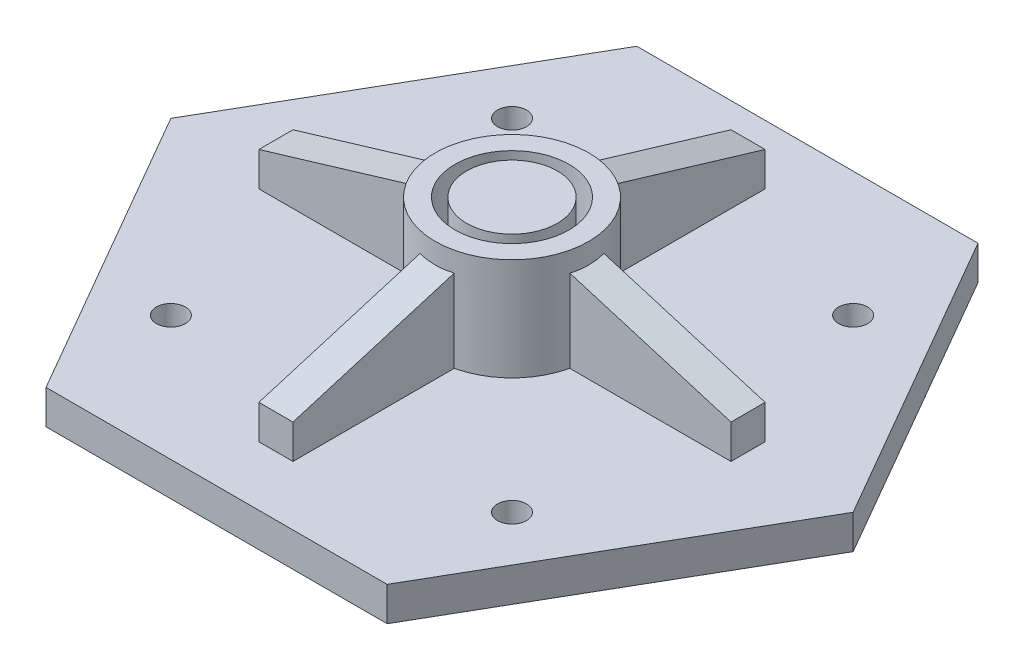
ISO-10303-21;
HEADER;
FILE_DESCRIPTION(('STEP AP214'),'2;1');
FILE_NAME('part.step','',(''),(''),'','','');
FILE_SCHEMA(('AUTOMOTIVE_DESIGN { 1 0 10303 214 1 1 1 1 }'));
ENDSEC;
DATA;
#1=APPLICATION_CONTEXT('core data for automotive mechanical design processes');
#2=APPLICATION_PROTOCOL_DEFINITION('international standard','automotive_design',2000,#1);
#3=PRODUCT_CONTEXT('',#1,'mechanical');
#4=PRODUCT('Part','Part','',(#3));
#5=PRODUCT_RELATED_PRODUCT_CATEGORY('part','',(#4));
#6=PRODUCT_DEFINITION_FORMATION('','',#4);
#7=PRODUCT_DEFINITION_CONTEXT('part definition',#1,'design');
#8=PRODUCT_DEFINITION('design','',#6,#7);
#9=PRODUCT_DEFINITION_SHAPE('','',#8);
#10=(LENGTH_UNIT() NAMED_UNIT(*) SI_UNIT(.MILLI.,.METRE.));
#11=(NAMED_UNIT(*) PLANE_ANGLE_UNIT() SI_UNIT($,.RADIAN.));
#12=(NAMED_UNIT(*) SI_UNIT($,.STERADIAN.) SOLID_ANGLE_UNIT());
#13=UNCERTAINTY_MEASURE_WITH_UNIT(LENGTH_MEASURE(1.E-05),#10,'distance_accuracy_value','');
#14=(GEOMETRIC_REPRESENTATION_CONTEXT(3) GLOBAL_UNCERTAINTY_ASSIGNED_CONTEXT((#13)) GLOBAL_UNIT_ASSIGNED_CONTEXT((#10,
#11,#12)) REPRESENTATION_CONTEXT('',''));
#15=CARTESIAN_POINT('',(0.,0.,0.));
#16=DIRECTION('',(0.,0.,1.));
#17=DIRECTION('',(1.,0.,0.));
#18=AXIS2_PLACEMENT_3D('',#15,#16,#17);
#19=CARTESIAN_POINT('',(0.,40.,0.));
#20=DIRECTION('',(0.,-1.,0.));
#21=DIRECTION('',(0.,0.,-1.));
#22=AXIS2_PLACEMENT_3D('',#19,#20,#21);
#23=CYLINDRICAL_SURFACE('',#22,22.5);
#24=CARTESIAN_POINT('',(0.,40.,0.));
#25=DIRECTION('',(0.,1.,0.));
#26=DIRECTION('',(0.,0.,1.));
#27=AXIS2_PLACEMENT_3D('',#24,#25,#26);
#28=CIRCLE('',#27,22.5);
#29=CARTESIAN_POINT('',(0.,40.,22.5));
#30=VERTEX_POINT('',#29);
#31=EDGE_CURVE('E348',#30,#30,#28,.T.);
#32=ORIENTED_EDGE('',*,*,#31,.F.);
#33=EDGE_LOOP('',(#32));
#34=FACE_BOUND('',#33,.T.);
#35=CARTESIAN_POINT('',(0.,40.76,0.));
#36=DIRECTION('',(0.287347885566345,-0.957826285221151,0.));
#37=DIRECTION('',(-0.957826285221151,-0.287347885566345,0.));
#38=AXIS2_PLACEMENT_3D('',#35,#36,#37);
#39=ELLIPSE('',#38,23.4906896450487,22.5);
#40=CARTESIAN_POINT('',(-21.9374109684803,34.1787767094559,4.99999999999992));
#41=VERTEX_POINT('',#40);
#42=CARTESIAN_POINT('',(-21.9374109684803,34.1787767094559,-5.00000000000008));
#43=VERTEX_POINT('',#42);
#44=EDGE_CURVE('E11',#41,#43,#39,.T.);
#45=ORIENTED_EDGE('',*,*,#44,.F.);
#46=DIRECTION('',(0.,-1.,0.));
#47=VECTOR('',#46,1.);
#48=CARTESIAN_POINT('',(-21.9374109684803,40.,4.99999999999992));
#49=LINE('',#48,#47);
#50=CARTESIAN_POINT('',(-21.9374109684803,10.,4.99999999999992));
#51=VERTEX_POINT('',#50);
#52=EDGE_CURVE('E190',#41,#51,#49,.T.);
#53=ORIENTED_EDGE('',*,*,#52,.T.);
#54=CARTESIAN_POINT('',(0.,10.,0.));
#55=DIRECTION('',(0.,-1.,0.));
#56=DIRECTION('',(0.,0.,-1.));
#57=AXIS2_PLACEMENT_3D('',#54,#55,#56);
#58=CIRCLE('',#57,22.5);
#59=CARTESIAN_POINT('',(-5.,10.,21.9374109684803));
#60=VERTEX_POINT('',#59);
#61=EDGE_CURVE('E354',#60,#51,#58,.T.);
#62=ORIENTED_EDGE('',*,*,#61,.F.);
#63=DIRECTION('',(0.,-1.,0.));
#64=VECTOR('',#63,1.);
#65=CARTESIAN_POINT('',(-5.,40.,21.9374109684803));
#66=LINE('',#65,#64);
#67=CARTESIAN_POINT('',(-5.,34.1787767094559,21.9374109684803));
#68=VERTEX_POINT('',#67);
#69=EDGE_CURVE('E284',#68,#60,#66,.T.);
#70=ORIENTED_EDGE('',*,*,#69,.F.);
#71=CARTESIAN_POINT('',(0.,40.76,0.));
#72=DIRECTION('',(0.,-0.957826285221151,-0.287347885566345));
#73=DIRECTION('',(0.,-0.287347885566345,0.957826285221151));
#74=AXIS2_PLACEMENT_3D('',#71,#72,#73);
#75=ELLIPSE('',#74,23.4906896450487,22.5);
#76=CARTESIAN_POINT('',(5.,34.1787767094559,21.9374109684803));
#77=VERTEX_POINT('',#76);
#78=EDGE_CURVE('E357',#77,#68,#75,.T.);
#79=ORIENTED_EDGE('',*,*,#78,.F.);
#80=DIRECTION('',(0.,-1.,0.));
#81=VECTOR('',#80,1.);
#82=CARTESIAN_POINT('',(5.,40.,21.9374109684803));
#83=LINE('',#82,#81);
#84=CARTESIAN_POINT('',(5.,10.,21.9374109684803));
#85=VERTEX_POINT('',#84);
#86=EDGE_CURVE('E287',#77,#85,#83,.T.);
#87=ORIENTED_EDGE('',*,*,#86,.T.);
#88=CARTESIAN_POINT('',(21.9374109684803,10.,5.00000000000023));
#89=VERTEX_POINT('',#88);
#90=EDGE_CURVE('E353',#89,#85,#58,.T.);
#91=ORIENTED_EDGE('',*,*,#90,.F.);
#92=DIRECTION('',(0.,-1.,0.));
#93=VECTOR('',#92,1.);
#94=CARTESIAN_POINT('',(21.9374109684803,40.,5.00000000000023));
#95=LINE('',#94,#93);
#96=CARTESIAN_POINT('',(21.9374109684803,34.1787767094559,5.00000000000023));
#97=VERTEX_POINT('',#96);
#98=EDGE_CURVE('E207',#97,#89,#95,.T.);
#99=ORIENTED_EDGE('',*,*,#98,.F.);
#100=CARTESIAN_POINT('',(0.,40.76,0.));
#101=DIRECTION('',(-0.287347885566345,-0.957826285221151,0.));
#102=DIRECTION('',(0.957826285221151,-0.287347885566345,0.));
#103=AXIS2_PLACEMENT_3D('',#100,#101,#102);
#104=ELLIPSE('',#103,23.4906896450487,22.5);
#105=CARTESIAN_POINT('',(21.9374109684804,34.1787767094559,-4.99999999999977));
#106=VERTEX_POINT('',#105);
#107=EDGE_CURVE('E361',#106,#97,#104,.T.);
#108=ORIENTED_EDGE('',*,*,#107,.F.);
#109=DIRECTION('',(0.,-1.,0.));
#110=VECTOR('',#109,1.);
#111=CARTESIAN_POINT('',(21.9374109684804,40.,-4.99999999999977));
#112=LINE('',#111,#110);
#113=CARTESIAN_POINT('',(21.9374109684804,10.,-4.99999999999977));
#114=VERTEX_POINT('',#113);
#115=EDGE_CURVE('E210',#106,#114,#112,.T.);
#116=ORIENTED_EDGE('',*,*,#115,.T.);
#117=CARTESIAN_POINT('',(5.,10.,-21.9374109684803));
#118=VERTEX_POINT('',#117);
#119=EDGE_CURVE('E385',#118,#114,#58,.T.);
#120=ORIENTED_EDGE('',*,*,#119,.F.);
#121=DIRECTION('',(0.,-1.,0.));
#122=VECTOR('',#121,1.);
#123=CARTESIAN_POINT('',(5.,40.,-21.9374109684803));
#124=LINE('',#123,#122);
#125=CARTESIAN_POINT('',(5.,34.1787767094559,-21.9374109684803));
#126=VERTEX_POINT('',#125);
#127=EDGE_CURVE('E257',#126,#118,#124,.T.);
#128=ORIENTED_EDGE('',*,*,#127,.F.);
#129=CARTESIAN_POINT('',(0.,40.76,0.));
#130=DIRECTION('',(0.,-0.957826285221151,0.287347885566345));
#131=DIRECTION('',(0.,-0.287347885566345,-0.957826285221151));
#132=AXIS2_PLACEMENT_3D('',#129,#130,#131);
#133=ELLIPSE('',#132,23.4906896450487,22.5);
#134=CARTESIAN_POINT('',(-5.,34.1787767094559,-21.9374109684803));
#135=VERTEX_POINT('',#134);
#136=EDGE_CURVE('E46',#135,#126,#133,.T.);
#137=ORIENTED_EDGE('',*,*,#136,.F.);
#138=DIRECTION('',(0.,-1.,0.));
#139=VECTOR('',#138,1.);
#140=CARTESIAN_POINT('',(-5.,40.,-21.9374109684803));
#141=LINE('',#140,#139);
#142=CARTESIAN_POINT('',(-5.,10.,-21.9374109684803));
#143=VERTEX_POINT('',#142);
#144=EDGE_CURVE('E260',#135,#143,#141,.T.);
#145=ORIENTED_EDGE('',*,*,#144,.T.);
#146=CARTESIAN_POINT('',(-21.9374109684803,10.,-5.00000000000008));
#147=VERTEX_POINT('',#146);
#148=EDGE_CURVE('E358',#147,#143,#58,.T.);
#149=ORIENTED_EDGE('',*,*,#148,.F.);
#150=DIRECTION('',(0.,-1.,0.));
#151=VECTOR('',#150,1.);
#152=CARTESIAN_POINT('',(-21.9374109684803,40.,-5.00000000000008));
#153=LINE('',#152,#151);
#154=EDGE_CURVE('E56',#43,#147,#153,.T.);
#155=ORIENTED_EDGE('',*,*,#154,.F.);
#156=EDGE_LOOP('',(#45,#53,#62,#70,#79,#87,#91,#99,#108,#116,#120,#128,#137,#145,#149,#155));
#157=FACE_BOUND('',#156,.T.);
#158=ADVANCED_FACE('F39',(#34,#157),#23,.T.);
#159=CARTESIAN_POINT('',(0.,40.,0.));
#160=DIRECTION('',(0.,1.,0.));
#161=DIRECTION('',(0.,0.,1.));
#162=AXIS2_PLACEMENT_3D('',#159,#160,#161);
#163=PLANE('',#162);
#164=CARTESIAN_POINT('',(0.,40.,0.));
#165=DIRECTION('',(0.,1.,0.));
#166=DIRECTION('',(0.,0.,1.));
#167=AXIS2_PLACEMENT_3D('',#164,#165,#166);
#168=CIRCLE('',#167,16.7);
#169=CARTESIAN_POINT('',(0.,40.,16.7));
#170=VERTEX_POINT('',#169);
#171=EDGE_CURVE('E342',#170,#170,#168,.T.);
#172=ORIENTED_EDGE('',*,*,#171,.F.);
#173=EDGE_LOOP('',(#172));
#174=FACE_BOUND('',#173,.T.);
#175=ORIENTED_EDGE('',*,*,#31,.T.);
#176=EDGE_LOOP('',(#175));
#177=FACE_BOUND('',#176,.T.);
#178=ADVANCED_FACE('F418',(#174,#177),#163,.T.);
#179=CARTESIAN_POINT('',(0.,10.,0.));
#180=DIRECTION('',(0.,1.,0.));
#181=DIRECTION('',(0.,0.,1.));
#182=AXIS2_PLACEMENT_3D('',#179,#180,#181);
#183=CYLINDRICAL_SURFACE('',#182,16.7);
#184=CARTESIAN_POINT('',(0.,10.,0.));
#185=DIRECTION('',(0.,1.,0.));
#186=DIRECTION('',(0.,0.,1.));
#187=AXIS2_PLACEMENT_3D('',#184,#185,#186);
#188=CIRCLE('',#187,16.7);
#189=CARTESIAN_POINT('',(0.,10.,16.7));
#190=VERTEX_POINT('',#189);
#191=EDGE_CURVE('E345',#190,#190,#188,.T.);
#192=ORIENTED_EDGE('',*,*,#191,.F.);
#193=EDGE_LOOP('',(#192));
#194=FACE_BOUND('',#193,.T.);
#195=ORIENTED_EDGE('',*,*,#171,.T.);
#196=EDGE_LOOP('',(#195));
#197=FACE_BOUND('',#196,.T.);
#198=ADVANCED_FACE('F424',(#194,#197),#183,.F.);
#199=CARTESIAN_POINT('',(0.,10.,0.));
#200=DIRECTION('',(0.,1.,0.));
#201=DIRECTION('',(0.,0.,1.));
#202=AXIS2_PLACEMENT_3D('',#199,#200,#201);
#203=PLANE('',#202);
#204=CARTESIAN_POINT('',(0.,10.,0.));
#205=DIRECTION('',(0.,1.,0.));
#206=DIRECTION('',(0.,0.,1.));
#207=AXIS2_PLACEMENT_3D('',#204,#205,#206);
#208=CIRCLE('',#207,13.3);
#209=CARTESIAN_POINT('',(0.,10.,13.3));
#210=VERTEX_POINT('',#209);
#211=EDGE_CURVE('E339',#210,#210,#208,.T.);
#212=ORIENTED_EDGE('',*,*,#211,.F.);
#213=EDGE_LOOP('',(#212));
#214=FACE_BOUND('',#213,.T.);
#215=ORIENTED_EDGE('',*,*,#191,.T.);
#216=EDGE_LOOP('',(#215));
#217=FACE_BOUND('',#216,.T.);
#218=ADVANCED_FACE('F433',(#214,#217),#203,.T.);
#219=CARTESIAN_POINT('',(0.,10.,0.));
#220=DIRECTION('',(0.,1.,0.));
#221=DIRECTION('',(0.,0.,1.));
#222=AXIS2_PLACEMENT_3D('',#219,#220,#221);
#223=CYLINDRICAL_SURFACE('',#222,13.3);
#224=ORIENTED_EDGE('',*,*,#211,.T.);
#225=EDGE_LOOP('',(#224));
#226=FACE_BOUND('',#225,.T.);
#227=CARTESIAN_POINT('',(0.,40.,0.));
#228=DIRECTION('',(0.,1.,0.));
#229=DIRECTION('',(0.,0.,1.));
#230=AXIS2_PLACEMENT_3D('',#227,#228,#229);
#231=CIRCLE('',#230,13.3);
#232=CARTESIAN_POINT('',(0.,40.,13.3));
#233=VERTEX_POINT('',#232);
#234=EDGE_CURVE('E329',#233,#233,#231,.T.);
#235=ORIENTED_EDGE('',*,*,#234,.F.);
#236=EDGE_LOOP('',(#235));
#237=FACE_BOUND('',#236,.T.);
#238=ADVANCED_FACE('F439',(#226,#237),#223,.T.);
#239=ORIENTED_EDGE('',*,*,#234,.T.);
#240=EDGE_LOOP('',(#239));
#241=FACE_BOUND('',#240,.T.);
#242=ADVANCED_FACE('F427',(#241),#163,.T.);
#243=CARTESIAN_POINT('',(100.,10.,0.));
#244=DIRECTION('',(0.866025403784438,0.,0.5));
#245=DIRECTION('',(0.5,0.,-0.866025403784438));
#246=AXIS2_PLACEMENT_3D('',#243,#244,#245);
#247=PLANE('',#246);
#248=DIRECTION('',(-0.5,0.,0.866025403784439));
#249=VECTOR('',#248,1.);
#250=CARTESIAN_POINT('',(100.,0.,0.));
#251=LINE('',#250,#249);
#252=CARTESIAN_POINT('',(100.,0.,0.));
#253=VERTEX_POINT('',#252);
#254=CARTESIAN_POINT('',(50.,0.,86.6025403784439));
#255=VERTEX_POINT('',#254);
#256=EDGE_CURVE('E290',#253,#255,#251,.T.);
#257=ORIENTED_EDGE('',*,*,#256,.F.);
#258=DIRECTION('',(0.,-1.,0.));
#259=VECTOR('',#258,1.);
#260=CARTESIAN_POINT('',(100.,10.,0.));
#261=LINE('',#260,#259);
#262=CARTESIAN_POINT('',(100.,10.,0.));
#263=VERTEX_POINT('',#262);
#264=EDGE_CURVE('E327',#263,#253,#261,.T.);
#265=ORIENTED_EDGE('',*,*,#264,.F.);
#266=DIRECTION('',(-0.5,0.,0.866025403784439));
#267=VECTOR('',#266,1.);
#268=CARTESIAN_POINT('',(100.,10.,0.));
#269=LINE('',#268,#267);
#270=CARTESIAN_POINT('',(50.,10.,86.6025403784439));
#271=VERTEX_POINT('',#270);
#272=EDGE_CURVE('E291',#263,#271,#269,.T.);
#273=ORIENTED_EDGE('',*,*,#272,.T.);
#274=DIRECTION('',(0.,-1.,0.));
#275=VECTOR('',#274,1.);
#276=CARTESIAN_POINT('',(50.,10.,86.6025403784439));
#277=LINE('',#276,#275);
#278=EDGE_CURVE('E310',#271,#255,#277,.T.);
#279=ORIENTED_EDGE('',*,*,#278,.T.);
#280=EDGE_LOOP('',(#257,#265,#273,#279));
#281=FACE_BOUND('',#280,.T.);
#282=ADVANCED_FACE('F438',(#281),#247,.T.);
#283=CARTESIAN_POINT('',(50.,10.,-86.6025403784439));
#284=DIRECTION('',(0.866025403784439,0.,-0.5));
#285=DIRECTION('',(-0.5,0.,-0.866025403784439));
#286=AXIS2_PLACEMENT_3D('',#283,#284,#285);
#287=PLANE('',#286);
#288=DIRECTION('',(0.5,0.,0.866025403784439));
#289=VECTOR('',#288,1.);
#290=CARTESIAN_POINT('',(50.,0.,-86.6025403784439));
#291=LINE('',#290,#289);
#292=CARTESIAN_POINT('',(50.,0.,-86.6025403784439));
#293=VERTEX_POINT('',#292);
#294=EDGE_CURVE('E295',#293,#253,#291,.T.);
#295=ORIENTED_EDGE('',*,*,#294,.F.);
#296=DIRECTION('',(0.,-1.,0.));
#297=VECTOR('',#296,1.);
#298=CARTESIAN_POINT('',(50.,10.,-86.6025403784439));
#299=LINE('',#298,#297);
#300=CARTESIAN_POINT('',(50.,10.,-86.6025403784439));
#301=VERTEX_POINT('',#300);
#302=EDGE_CURVE('E330',#301,#293,#299,.T.);
#303=ORIENTED_EDGE('',*,*,#302,.F.);
#304=DIRECTION('',(0.5,0.,0.866025403784439));
#305=VECTOR('',#304,1.);
#306=CARTESIAN_POINT('',(50.,10.,-86.6025403784439));
#307=LINE('',#306,#305);
#308=EDGE_CURVE('E307',#301,#263,#307,.T.);
#309=ORIENTED_EDGE('',*,*,#308,.T.);
#310=ORIENTED_EDGE('',*,*,#264,.T.);
#311=EDGE_LOOP('',(#295,#303,#309,#310));
#312=FACE_BOUND('',#311,.T.);
#313=ADVANCED_FACE('F445',(#312),#287,.T.);
#314=CARTESIAN_POINT('',(-50.,10.,-86.6025403784439));
#315=DIRECTION('',(0.,0.,-1.));
#316=DIRECTION('',(-1.,0.,0.));
#317=AXIS2_PLACEMENT_3D('',#314,#315,#316);
#318=PLANE('',#317);
#319=DIRECTION('',(1.,0.,0.));
#320=VECTOR('',#319,1.);
#321=CARTESIAN_POINT('',(-50.,0.,-86.6025403784439));
#322=LINE('',#321,#320);
#323=CARTESIAN_POINT('',(-50.,0.,-86.6025403784439));
#324=VERTEX_POINT('',#323);
#325=EDGE_CURVE('E322',#324,#293,#322,.T.);
#326=ORIENTED_EDGE('',*,*,#325,.F.);
#327=DIRECTION('',(0.,-1.,0.));
#328=VECTOR('',#327,1.);
#329=CARTESIAN_POINT('',(-50.,10.,-86.6025403784439));
#330=LINE('',#329,#328);
#331=CARTESIAN_POINT('',(-50.,10.,-86.6025403784439));
#332=VERTEX_POINT('',#331);
#333=EDGE_CURVE('E332',#332,#324,#330,.T.);
#334=ORIENTED_EDGE('',*,*,#333,.F.);
#335=DIRECTION('',(1.,0.,0.));
#336=VECTOR('',#335,1.);
#337=CARTESIAN_POINT('',(-50.,10.,-86.6025403784439));
#338=LINE('',#337,#336);
#339=EDGE_CURVE('E304',#332,#301,#338,.T.);
#340=ORIENTED_EDGE('',*,*,#339,.T.);
#341=ORIENTED_EDGE('',*,*,#302,.T.);
#342=EDGE_LOOP('',(#326,#334,#340,#341));
#343=FACE_BOUND('',#342,.T.);
#344=ADVANCED_FACE('F469',(#343),#318,.T.);
#345=CARTESIAN_POINT('',(-100.,10.,0.));
#346=DIRECTION('',(-0.866025403784439,0.,-0.5));
#347=DIRECTION('',(-0.5,0.,0.866025403784439));
#348=AXIS2_PLACEMENT_3D('',#345,#346,#347);
#349=PLANE('',#348);
#350=DIRECTION('',(0.5,0.,-0.866025403784439));
#351=VECTOR('',#350,1.);
#352=CARTESIAN_POINT('',(-100.,0.,0.));
#353=LINE('',#352,#351);
#354=CARTESIAN_POINT('',(-100.,0.,0.));
#355=VERTEX_POINT('',#354);
#356=EDGE_CURVE('E319',#355,#324,#353,.T.);
#357=ORIENTED_EDGE('',*,*,#356,.F.);
#358=DIRECTION('',(0.,-1.,0.));
#359=VECTOR('',#358,1.);
#360=CARTESIAN_POINT('',(-100.,10.,0.));
#361=LINE('',#360,#359);
#362=CARTESIAN_POINT('',(-100.,10.,0.));
#363=VERTEX_POINT('',#362);
#364=EDGE_CURVE('E334',#363,#355,#361,.T.);
#365=ORIENTED_EDGE('',*,*,#364,.F.);
#366=DIRECTION('',(0.5,0.,-0.866025403784439));
#367=VECTOR('',#366,1.);
#368=CARTESIAN_POINT('',(-100.,10.,0.));
#369=LINE('',#368,#367);
#370=EDGE_CURVE('E301',#363,#332,#369,.T.);
#371=ORIENTED_EDGE('',*,*,#370,.T.);
#372=ORIENTED_EDGE('',*,*,#333,.T.);
#373=EDGE_LOOP('',(#357,#365,#371,#372));
#374=FACE_BOUND('',#373,.T.);
#375=ADVANCED_FACE('F465',(#374),#349,.T.);
#376=CARTESIAN_POINT('',(-50.,10.,86.6025403784439));
#377=DIRECTION('',(-0.866025403784439,0.,0.5));
#378=DIRECTION('',(0.5,0.,0.866025403784439));
#379=AXIS2_PLACEMENT_3D('',#376,#377,#378);
#380=PLANE('',#379);
#381=DIRECTION('',(-0.5,0.,-0.866025403784439));
#382=VECTOR('',#381,1.);
#383=CARTESIAN_POINT('',(-50.,0.,86.6025403784439));
#384=LINE('',#383,#382);
#385=CARTESIAN_POINT('',(-50.,0.,86.6025403784439));
#386=VERTEX_POINT('',#385);
#387=EDGE_CURVE('E316',#386,#355,#384,.T.);
#388=ORIENTED_EDGE('',*,*,#387,.F.);
#389=DIRECTION('',(0.,-1.,0.));
#390=VECTOR('',#389,1.);
#391=CARTESIAN_POINT('',(-50.,10.,86.6025403784439));
#392=LINE('',#391,#390);
#393=CARTESIAN_POINT('',(-50.,10.,86.6025403784439));
#394=VERTEX_POINT('',#393);
#395=EDGE_CURVE('E336',#394,#386,#392,.T.);
#396=ORIENTED_EDGE('',*,*,#395,.F.);
#397=DIRECTION('',(-0.5,0.,-0.866025403784439));
#398=VECTOR('',#397,1.);
#399=CARTESIAN_POINT('',(-50.,10.,86.6025403784439));
#400=LINE('',#399,#398);
#401=EDGE_CURVE('E298',#394,#363,#400,.T.);
#402=ORIENTED_EDGE('',*,*,#401,.T.);
#403=ORIENTED_EDGE('',*,*,#364,.T.);
#404=EDGE_LOOP('',(#388,#396,#402,#403));
#405=FACE_BOUND('',#404,.T.);
#406=ADVANCED_FACE('F461',(#405),#380,.T.);
#407=CARTESIAN_POINT('',(50.,10.,86.6025403784439));
#408=DIRECTION('',(0.,0.,1.));
#409=DIRECTION('',(1.,0.,0.));
#410=AXIS2_PLACEMENT_3D('',#407,#408,#409);
#411=PLANE('',#410);
#412=DIRECTION('',(-1.,0.,0.));
#413=VECTOR('',#412,1.);
#414=CARTESIAN_POINT('',(50.,0.,86.6025403784439));
#415=LINE('',#414,#413);
#416=EDGE_CURVE('E313',#255,#386,#415,.T.);
#417=ORIENTED_EDGE('',*,*,#416,.F.);
#418=ORIENTED_EDGE('',*,*,#278,.F.);
#419=DIRECTION('',(-1.,0.,0.));
#420=VECTOR('',#419,1.);
#421=CARTESIAN_POINT('',(50.,10.,86.6025403784439));
#422=LINE('',#421,#420);
#423=EDGE_CURVE('E294',#271,#394,#422,.T.);
#424=ORIENTED_EDGE('',*,*,#423,.T.);
#425=ORIENTED_EDGE('',*,*,#395,.T.);
#426=EDGE_LOOP('',(#417,#418,#424,#425));
#427=FACE_BOUND('',#426,.T.);
#428=ADVANCED_FACE('F458',(#427),#411,.T.);
#429=CARTESIAN_POINT('',(0.,10.,0.));
#430=DIRECTION('',(0.,-1.,0.));
#431=DIRECTION('',(0.,0.,-1.));
#432=AXIS2_PLACEMENT_3D('',#429,#430,#431);
#433=PLANE('',#432);
#434=CARTESIAN_POINT('',(50.,10.,-50.));
#435=DIRECTION('',(0.,1.,0.));
#436=DIRECTION('',(0.,0.,1.));
#437=AXIS2_PLACEMENT_3D('',#434,#435,#436);
#438=CIRCLE('',#437,4.25);
#439=CARTESIAN_POINT('',(50.,10.,-45.75));
#440=VERTEX_POINT('',#439);
#441=EDGE_CURVE('E487',#440,#440,#438,.T.);
#442=ORIENTED_EDGE('',*,*,#441,.F.);
#443=EDGE_LOOP('',(#442));
#444=FACE_BOUND('',#443,.T.);
#445=CARTESIAN_POINT('',(-50.,10.,50.));
#446=DIRECTION('',(0.,1.,0.));
#447=DIRECTION('',(0.,0.,1.));
#448=AXIS2_PLACEMENT_3D('',#445,#446,#447);
#449=CIRCLE('',#448,4.25);
#450=CARTESIAN_POINT('',(-50.,10.,54.25));
#451=VERTEX_POINT('',#450);
#452=EDGE_CURVE('E491',#451,#451,#449,.T.);
#453=ORIENTED_EDGE('',*,*,#452,.F.);
#454=EDGE_LOOP('',(#453));
#455=FACE_BOUND('',#454,.T.);
#456=CARTESIAN_POINT('',(50.,10.,50.));
#457=DIRECTION('',(0.,1.,0.));
#458=DIRECTION('',(0.,0.,1.));
#459=AXIS2_PLACEMENT_3D('',#456,#457,#458);
#460=CIRCLE('',#459,4.25);
#461=CARTESIAN_POINT('',(50.,10.,54.25));
#462=VERTEX_POINT('',#461);
#463=EDGE_CURVE('E495',#462,#462,#460,.T.);
#464=ORIENTED_EDGE('',*,*,#463,.F.);
#465=EDGE_LOOP('',(#464));
#466=FACE_BOUND('',#465,.T.);
#467=CARTESIAN_POINT('',(-50.,10.,-50.));
#468=DIRECTION('',(0.,1.,0.));
#469=DIRECTION('',(0.,0.,1.));
#470=AXIS2_PLACEMENT_3D('',#467,#468,#469);
#471=CIRCLE('',#470,4.25);
#472=CARTESIAN_POINT('',(-50.,10.,-45.75));
#473=VERTEX_POINT('',#472);
#474=EDGE_CURVE('E498',#473,#473,#471,.T.);
#475=ORIENTED_EDGE('',*,*,#474,.F.);
#476=EDGE_LOOP('',(#475));
#477=FACE_BOUND('',#476,.T.);
#478=ORIENTED_EDGE('',*,*,#61,.T.);
#479=DIRECTION('',(1.,0.,0.));
#480=VECTOR('',#479,1.);
#481=CARTESIAN_POINT('',(-69.2,10.,4.99999999999976));
#482=LINE('',#481,#480);
#483=CARTESIAN_POINT('',(-69.2,10.,4.99999999999976));
#484=VERTEX_POINT('',#483);
#485=EDGE_CURVE('E201',#484,#51,#482,.T.);
#486=ORIENTED_EDGE('',*,*,#485,.F.);
#487=DIRECTION('',(0.,0.,-1.));
#488=VECTOR('',#487,1.);
#489=CARTESIAN_POINT('',(-69.2,10.,4.99999999999976));
#490=LINE('',#489,#488);
#491=CARTESIAN_POINT('',(-69.2,10.,-5.00000000000024));
#492=VERTEX_POINT('',#491);
#493=EDGE_CURVE('E200',#484,#492,#490,.T.);
#494=ORIENTED_EDGE('',*,*,#493,.T.);
#495=DIRECTION('',(1.,0.,0.));
#496=VECTOR('',#495,1.);
#497=CARTESIAN_POINT('',(-69.2,10.,-5.00000000000024));
#498=LINE('',#497,#496);
#499=EDGE_CURVE('E193',#492,#147,#498,.T.);
#500=ORIENTED_EDGE('',*,*,#499,.T.);
#501=ORIENTED_EDGE('',*,*,#148,.T.);
#502=DIRECTION('',(0.,0.,1.));
#503=VECTOR('',#502,1.);
#504=CARTESIAN_POINT('',(-5.,10.,-69.2));
#505=LINE('',#504,#503);
#506=CARTESIAN_POINT('',(-5.,10.,-69.2));
#507=VERTEX_POINT('',#506);
#508=EDGE_CURVE('E221',#507,#143,#505,.T.);
#509=ORIENTED_EDGE('',*,*,#508,.F.);
#510=DIRECTION('',(1.,0.,0.));
#511=VECTOR('',#510,1.);
#512=CARTESIAN_POINT('',(-5.,10.,-69.2));
#513=LINE('',#512,#511);
#514=CARTESIAN_POINT('',(5.,10.,-69.2));
#515=VERTEX_POINT('',#514);
#516=EDGE_CURVE('E224',#507,#515,#513,.T.);
#517=ORIENTED_EDGE('',*,*,#516,.T.);
#518=DIRECTION('',(0.,0.,1.));
#519=VECTOR('',#518,1.);
#520=CARTESIAN_POINT('',(5.,10.,-69.2));
#521=LINE('',#520,#519);
#522=EDGE_CURVE('E218',#515,#118,#521,.T.);
#523=ORIENTED_EDGE('',*,*,#522,.T.);
#524=ORIENTED_EDGE('',*,*,#119,.T.);
#525=DIRECTION('',(-1.,0.,0.));
#526=VECTOR('',#525,1.);
#527=CARTESIAN_POINT('',(69.2000000000001,10.,-4.99999999999928));
#528=LINE('',#527,#526);
#529=CARTESIAN_POINT('',(69.2000000000001,10.,-4.99999999999928));
#530=VERTEX_POINT('',#529);
#531=EDGE_CURVE('E242',#530,#114,#528,.T.);
#532=ORIENTED_EDGE('',*,*,#531,.F.);
#533=DIRECTION('',(0.,0.,1.));
#534=VECTOR('',#533,1.);
#535=CARTESIAN_POINT('',(69.2000000000001,10.,-4.99999999999928));
#536=LINE('',#535,#534);
#537=CARTESIAN_POINT('',(69.1999999999999,10.,5.00000000000073));
#538=VERTEX_POINT('',#537);
#539=EDGE_CURVE('E245',#530,#538,#536,.T.);
#540=ORIENTED_EDGE('',*,*,#539,.T.);
#541=DIRECTION('',(-1.,0.,0.));
#542=VECTOR('',#541,1.);
#543=CARTESIAN_POINT('',(69.1999999999999,10.,5.00000000000073));
#544=LINE('',#543,#542);
#545=EDGE_CURVE('E239',#538,#89,#544,.T.);
#546=ORIENTED_EDGE('',*,*,#545,.T.);
#547=ORIENTED_EDGE('',*,*,#90,.T.);
#548=DIRECTION('',(0.,0.,-1.));
#549=VECTOR('',#548,1.);
#550=CARTESIAN_POINT('',(5.,10.,69.2));
#551=LINE('',#550,#549);
#552=CARTESIAN_POINT('',(5.,10.,69.2));
#553=VERTEX_POINT('',#552);
#554=EDGE_CURVE('E271',#553,#85,#551,.T.);
#555=ORIENTED_EDGE('',*,*,#554,.F.);
#556=DIRECTION('',(-1.,0.,0.));
#557=VECTOR('',#556,1.);
#558=CARTESIAN_POINT('',(5.,10.,69.2));
#559=LINE('',#558,#557);
#560=CARTESIAN_POINT('',(-5.,10.,69.2));
#561=VERTEX_POINT('',#560);
#562=EDGE_CURVE('E274',#553,#561,#559,.T.);
#563=ORIENTED_EDGE('',*,*,#562,.T.);
#564=DIRECTION('',(0.,0.,-1.));
#565=VECTOR('',#564,1.);
#566=CARTESIAN_POINT('',(-5.,10.,69.2));
#567=LINE('',#566,#565);
#568=EDGE_CURVE('E268',#561,#60,#567,.T.);
#569=ORIENTED_EDGE('',*,*,#568,.T.);
#570=EDGE_LOOP('',(#478,#486,#494,#500,#501,#509,#517,#523,#524,#532,#540,#546,#547,#555,#563,#569));
#571=FACE_BOUND('',#570,.T.);
#572=ORIENTED_EDGE('',*,*,#272,.F.);
#573=ORIENTED_EDGE('',*,*,#308,.F.);
#574=ORIENTED_EDGE('',*,*,#339,.F.);
#575=ORIENTED_EDGE('',*,*,#370,.F.);
#576=ORIENTED_EDGE('',*,*,#401,.F.);
#577=ORIENTED_EDGE('',*,*,#423,.F.);
#578=EDGE_LOOP('',(#572,#573,#574,#575,#576,#577));
#579=FACE_BOUND('',#578,.T.);
#580=ADVANCED_FACE('F382',(#444,#455,#466,#477,#571,#579),#433,.F.);
#581=CARTESIAN_POINT('',(0.,0.,0.));
#582=DIRECTION('',(0.,1.,0.));
#583=DIRECTION('',(0.,0.,1.));
#584=AXIS2_PLACEMENT_3D('',#581,#582,#583);
#585=PLANE('',#584);
#586=CARTESIAN_POINT('',(50.,0.,-50.));
#587=DIRECTION('',(0.,1.,0.));
#588=DIRECTION('',(0.,0.,1.));
#589=AXIS2_PLACEMENT_3D('',#586,#587,#588);
#590=CIRCLE('',#589,4.25);
#591=CARTESIAN_POINT('',(50.,0.,-45.75));
#592=VERTEX_POINT('',#591);
#593=EDGE_CURVE('E503',#592,#592,#590,.T.);
#594=ORIENTED_EDGE('',*,*,#593,.T.);
#595=EDGE_LOOP('',(#594));
#596=FACE_BOUND('',#595,.T.);
#597=CARTESIAN_POINT('',(-50.,0.,50.));
#598=DIRECTION('',(0.,1.,0.));
#599=DIRECTION('',(0.,0.,1.));
#600=AXIS2_PLACEMENT_3D('',#597,#598,#599);
#601=CIRCLE('',#600,4.25);
#602=CARTESIAN_POINT('',(-50.,0.,54.25));
#603=VERTEX_POINT('',#602);
#604=EDGE_CURVE('E683',#603,#603,#601,.T.);
#605=ORIENTED_EDGE('',*,*,#604,.T.);
#606=EDGE_LOOP('',(#605));
#607=FACE_BOUND('',#606,.T.);
#608=CARTESIAN_POINT('',(50.,0.,50.));
#609=DIRECTION('',(0.,1.,0.));
#610=DIRECTION('',(0.,0.,1.));
#611=AXIS2_PLACEMENT_3D('',#608,#609,#610);
#612=CIRCLE('',#611,4.25);
#613=CARTESIAN_POINT('',(50.,0.,54.25));
#614=VERTEX_POINT('',#613);
#615=EDGE_CURVE('E689',#614,#614,#612,.T.);
#616=ORIENTED_EDGE('',*,*,#615,.T.);
#617=EDGE_LOOP('',(#616));
#618=FACE_BOUND('',#617,.T.);
#619=CARTESIAN_POINT('',(-50.,0.,-50.));
#620=DIRECTION('',(0.,1.,0.));
#621=DIRECTION('',(0.,0.,1.));
#622=AXIS2_PLACEMENT_3D('',#619,#620,#621);
#623=CIRCLE('',#622,4.25);
#624=CARTESIAN_POINT('',(-50.,0.,-45.75));
#625=VERTEX_POINT('',#624);
#626=EDGE_CURVE('E249',#625,#625,#623,.T.);
#627=ORIENTED_EDGE('',*,*,#626,.T.);
#628=EDGE_LOOP('',(#627));
#629=FACE_BOUND('',#628,.T.);
#630=ORIENTED_EDGE('',*,*,#256,.T.);
#631=ORIENTED_EDGE('',*,*,#416,.T.);
#632=ORIENTED_EDGE('',*,*,#387,.T.);
#633=ORIENTED_EDGE('',*,*,#356,.T.);
#634=ORIENTED_EDGE('',*,*,#325,.T.);
#635=ORIENTED_EDGE('',*,*,#294,.T.);
#636=EDGE_LOOP('',(#630,#631,#632,#633,#634,#635));
#637=FACE_BOUND('',#636,.T.);
#638=ADVANCED_FACE('F477',(#596,#607,#618,#629,#637),#585,.F.);
#639=CARTESIAN_POINT('',(5.,0.,0.));
#640=DIRECTION('',(1.,0.,0.));
#641=DIRECTION('',(0.,0.,-1.));
#642=AXIS2_PLACEMENT_3D('',#639,#640,#641);
#643=PLANE('',#642);
#644=ORIENTED_EDGE('',*,*,#86,.F.);
#645=DIRECTION('',(0.,-0.287347885566345,0.957826285221151));
#646=VECTOR('',#645,1.);
#647=CARTESIAN_POINT('',(5.,35.,19.2));
#648=LINE('',#647,#646);
#649=CARTESIAN_POINT('',(5.,20.,69.2));
#650=VERTEX_POINT('',#649);
#651=EDGE_CURVE('E265',#77,#650,#648,.T.);
#652=ORIENTED_EDGE('',*,*,#651,.T.);
#653=DIRECTION('',(0.,-1.,0.));
#654=VECTOR('',#653,1.);
#655=CARTESIAN_POINT('',(5.,20.,69.2));
#656=LINE('',#655,#654);
#657=EDGE_CURVE('E267',#650,#553,#656,.T.);
#658=ORIENTED_EDGE('',*,*,#657,.T.);
#659=ORIENTED_EDGE('',*,*,#554,.T.);
#660=EDGE_LOOP('',(#644,#652,#658,#659));
#661=FACE_BOUND('',#660,.T.);
#662=ADVANCED_FACE('F393',(#661),#643,.T.);
#663=CARTESIAN_POINT('',(-5.,0.,0.));
#664=DIRECTION('',(1.,0.,0.));
#665=DIRECTION('',(0.,0.,-1.));
#666=AXIS2_PLACEMENT_3D('',#663,#664,#665);
#667=PLANE('',#666);
#668=DIRECTION('',(0.,-0.287347885566345,0.957826285221151));
#669=VECTOR('',#668,1.);
#670=CARTESIAN_POINT('',(-5.,35.,19.2));
#671=LINE('',#670,#669);
#672=CARTESIAN_POINT('',(-5.,20.,69.2));
#673=VERTEX_POINT('',#672);
#674=EDGE_CURVE('E264',#68,#673,#671,.T.);
#675=ORIENTED_EDGE('',*,*,#674,.F.);
#676=ORIENTED_EDGE('',*,*,#69,.T.);
#677=ORIENTED_EDGE('',*,*,#568,.F.);
#678=DIRECTION('',(0.,-1.,0.));
#679=VECTOR('',#678,1.);
#680=CARTESIAN_POINT('',(-5.,20.,69.2));
#681=LINE('',#680,#679);
#682=EDGE_CURVE('E276',#673,#561,#681,.T.);
#683=ORIENTED_EDGE('',*,*,#682,.F.);
#684=EDGE_LOOP('',(#675,#676,#677,#683));
#685=FACE_BOUND('',#684,.T.);
#686=ADVANCED_FACE('F404',(#685),#667,.F.);
#687=CARTESIAN_POINT('',(5.,35.,19.2));
#688=DIRECTION('',(0.,-0.957826285221151,-0.287347885566345));
#689=DIRECTION('',(0.,0.287347885566345,-0.957826285221151));
#690=AXIS2_PLACEMENT_3D('',#687,#688,#689);
#691=PLANE('',#690);
#692=ORIENTED_EDGE('',*,*,#651,.F.);
#693=ORIENTED_EDGE('',*,*,#78,.T.);
#694=ORIENTED_EDGE('',*,*,#674,.T.);
#695=DIRECTION('',(-1.,0.,0.));
#696=VECTOR('',#695,1.);
#697=CARTESIAN_POINT('',(5.,20.,69.2));
#698=LINE('',#697,#696);
#699=EDGE_CURVE('E281',#650,#673,#698,.T.);
#700=ORIENTED_EDGE('',*,*,#699,.F.);
#701=EDGE_LOOP('',(#692,#693,#694,#700));
#702=FACE_BOUND('',#701,.T.);
#703=ADVANCED_FACE('F406',(#702),#691,.F.);
#704=CARTESIAN_POINT('',(5.,20.,69.2));
#705=DIRECTION('',(0.,0.,-1.));
#706=DIRECTION('',(-1.,0.,0.));
#707=AXIS2_PLACEMENT_3D('',#704,#705,#706);
#708=PLANE('',#707);
#709=ORIENTED_EDGE('',*,*,#682,.T.);
#710=ORIENTED_EDGE('',*,*,#562,.F.);
#711=ORIENTED_EDGE('',*,*,#657,.F.);
#712=ORIENTED_EDGE('',*,*,#699,.T.);
#713=EDGE_LOOP('',(#709,#710,#711,#712));
#714=FACE_BOUND('',#713,.T.);
#715=ADVANCED_FACE('F398',(#714),#708,.F.);
#716=CARTESIAN_POINT('',(0.,0.,-5.));
#717=DIRECTION('',(0.,0.,-1.));
#718=DIRECTION('',(-1.,0.,0.));
#719=AXIS2_PLACEMENT_3D('',#716,#717,#718);
#720=PLANE('',#719);
#721=ORIENTED_EDGE('',*,*,#115,.F.);
#722=DIRECTION('',(0.957826285221151,-0.287347885566345,0.));
#723=VECTOR('',#722,1.);
#724=CARTESIAN_POINT('',(19.2000000000001,35.,-4.9999999999998));
#725=LINE('',#724,#723);
#726=CARTESIAN_POINT('',(69.2000000000001,20.,-4.99999999999928));
#727=VERTEX_POINT('',#726);
#728=EDGE_CURVE('E236',#106,#727,#725,.T.);
#729=ORIENTED_EDGE('',*,*,#728,.T.);
#730=DIRECTION('',(0.,-1.,0.));
#731=VECTOR('',#730,1.);
#732=CARTESIAN_POINT('',(69.2000000000001,20.,-4.99999999999928));
#733=LINE('',#732,#731);
#734=EDGE_CURVE('E238',#727,#530,#733,.T.);
#735=ORIENTED_EDGE('',*,*,#734,.T.);
#736=ORIENTED_EDGE('',*,*,#531,.T.);
#737=EDGE_LOOP('',(#721,#729,#735,#736));
#738=FACE_BOUND('',#737,.T.);
#739=ADVANCED_FACE('F413',(#738),#720,.T.);
#740=CARTESIAN_POINT('',(0.,0.,5.));
#741=DIRECTION('',(0.,0.,-1.));
#742=DIRECTION('',(-1.,0.,0.));
#743=AXIS2_PLACEMENT_3D('',#740,#741,#742);
#744=PLANE('',#743);
#745=DIRECTION('',(0.957826285221151,-0.287347885566345,0.));
#746=VECTOR('',#745,1.);
#747=CARTESIAN_POINT('',(19.1999999999999,35.,5.0000000000002));
#748=LINE('',#747,#746);
#749=CARTESIAN_POINT('',(69.1999999999999,20.,5.00000000000073));
#750=VERTEX_POINT('',#749);
#751=EDGE_CURVE('E246',#97,#750,#748,.T.);
#752=ORIENTED_EDGE('',*,*,#751,.F.);
#753=ORIENTED_EDGE('',*,*,#98,.T.);
#754=ORIENTED_EDGE('',*,*,#545,.F.);
#755=DIRECTION('',(0.,-1.,0.));
#756=VECTOR('',#755,1.);
#757=CARTESIAN_POINT('',(69.1999999999999,20.,5.00000000000073));
#758=LINE('',#757,#756);
#759=EDGE_CURVE('E248',#750,#538,#758,.T.);
#760=ORIENTED_EDGE('',*,*,#759,.F.);
#761=EDGE_LOOP('',(#752,#753,#754,#760));
#762=FACE_BOUND('',#761,.T.);
#763=ADVANCED_FACE('F534',(#762),#744,.F.);
#764=CARTESIAN_POINT('',(19.2000000000001,35.,-4.9999999999998));
#765=DIRECTION('',(-0.287347885566345,-0.957826285221151,0.));
#766=DIRECTION('',(0.957826285221151,-0.287347885566345,0.));
#767=AXIS2_PLACEMENT_3D('',#764,#765,#766);
#768=PLANE('',#767);
#769=ORIENTED_EDGE('',*,*,#728,.F.);
#770=ORIENTED_EDGE('',*,*,#107,.T.);
#771=ORIENTED_EDGE('',*,*,#751,.T.);
#772=DIRECTION('',(0.,0.,1.));
#773=VECTOR('',#772,1.);
#774=CARTESIAN_POINT('',(69.2000000000001,20.,-4.99999999999928));
#775=LINE('',#774,#773);
#776=EDGE_CURVE('E228',#727,#750,#775,.T.);
#777=ORIENTED_EDGE('',*,*,#776,.F.);
#778=EDGE_LOOP('',(#769,#770,#771,#777));
#779=FACE_BOUND('',#778,.T.);
#780=ADVANCED_FACE('F538',(#779),#768,.F.);
#781=CARTESIAN_POINT('',(69.2000000000001,20.,-4.99999999999928));
#782=DIRECTION('',(-1.,0.,0.));
#783=DIRECTION('',(0.,0.,1.));
#784=AXIS2_PLACEMENT_3D('',#781,#782,#783);
#785=PLANE('',#784);
#786=ORIENTED_EDGE('',*,*,#759,.T.);
#787=ORIENTED_EDGE('',*,*,#539,.F.);
#788=ORIENTED_EDGE('',*,*,#734,.F.);
#789=ORIENTED_EDGE('',*,*,#776,.T.);
#790=EDGE_LOOP('',(#786,#787,#788,#789));
#791=FACE_BOUND('',#790,.T.);
#792=ADVANCED_FACE('F526',(#791),#785,.F.);
#793=CARTESIAN_POINT('',(-5.,0.,0.));
#794=DIRECTION('',(-1.,0.,0.));
#795=DIRECTION('',(0.,0.,1.));
#796=AXIS2_PLACEMENT_3D('',#793,#794,#795);
#797=PLANE('',#796);
#798=ORIENTED_EDGE('',*,*,#144,.F.);
#799=DIRECTION('',(0.,-0.287347885566345,-0.957826285221151));
#800=VECTOR('',#799,1.);
#801=CARTESIAN_POINT('',(-5.,35.,-19.2));
#802=LINE('',#801,#800);
#803=CARTESIAN_POINT('',(-5.,20.,-69.2));
#804=VERTEX_POINT('',#803);
#805=EDGE_CURVE('E215',#135,#804,#802,.T.);
#806=ORIENTED_EDGE('',*,*,#805,.T.);
#807=DIRECTION('',(0.,-1.,0.));
#808=VECTOR('',#807,1.);
#809=CARTESIAN_POINT('',(-5.,20.,-69.2));
#810=LINE('',#809,#808);
#811=EDGE_CURVE('E217',#804,#507,#810,.T.);
#812=ORIENTED_EDGE('',*,*,#811,.T.);
#813=ORIENTED_EDGE('',*,*,#508,.T.);
#814=EDGE_LOOP('',(#798,#806,#812,#813));
#815=FACE_BOUND('',#814,.T.);
#816=ADVANCED_FACE('F379',(#815),#797,.T.);
#817=CARTESIAN_POINT('',(5.,0.,0.));
#818=DIRECTION('',(-1.,0.,0.));
#819=DIRECTION('',(0.,0.,1.));
#820=AXIS2_PLACEMENT_3D('',#817,#818,#819);
#821=PLANE('',#820);
#822=DIRECTION('',(0.,-0.287347885566345,-0.957826285221151));
#823=VECTOR('',#822,1.);
#824=CARTESIAN_POINT('',(5.,35.,-19.2));
#825=LINE('',#824,#823);
#826=CARTESIAN_POINT('',(5.,20.,-69.2));
#827=VERTEX_POINT('',#826);
#828=EDGE_CURVE('E225',#126,#827,#825,.T.);
#829=ORIENTED_EDGE('',*,*,#828,.F.);
#830=ORIENTED_EDGE('',*,*,#127,.T.);
#831=ORIENTED_EDGE('',*,*,#522,.F.);
#832=DIRECTION('',(0.,-1.,0.));
#833=VECTOR('',#832,1.);
#834=CARTESIAN_POINT('',(5.,20.,-69.2));
#835=LINE('',#834,#833);
#836=EDGE_CURVE('E227',#827,#515,#835,.T.);
#837=ORIENTED_EDGE('',*,*,#836,.F.);
#838=EDGE_LOOP('',(#829,#830,#831,#837));
#839=FACE_BOUND('',#838,.T.);
#840=ADVANCED_FACE('F372',(#839),#821,.F.);
#841=CARTESIAN_POINT('',(-5.,35.,-19.2));
#842=DIRECTION('',(0.,-0.957826285221151,0.287347885566345));
#843=DIRECTION('',(0.,-0.287347885566345,-0.957826285221151));
#844=AXIS2_PLACEMENT_3D('',#841,#842,#843);
#845=PLANE('',#844);
#846=ORIENTED_EDGE('',*,*,#805,.F.);
#847=ORIENTED_EDGE('',*,*,#136,.T.);
#848=ORIENTED_EDGE('',*,*,#828,.T.);
#849=DIRECTION('',(1.,0.,0.));
#850=VECTOR('',#849,1.);
#851=CARTESIAN_POINT('',(-5.,20.,-69.2));
#852=LINE('',#851,#850);
#853=EDGE_CURVE('E233',#804,#827,#852,.T.);
#854=ORIENTED_EDGE('',*,*,#853,.F.);
#855=EDGE_LOOP('',(#846,#847,#848,#854));
#856=FACE_BOUND('',#855,.T.);
#857=ADVANCED_FACE('F367',(#856),#845,.F.);
#858=CARTESIAN_POINT('',(-5.,20.,-69.2));
#859=DIRECTION('',(0.,0.,1.));
#860=DIRECTION('',(1.,0.,0.));
#861=AXIS2_PLACEMENT_3D('',#858,#859,#860);
#862=PLANE('',#861);
#863=ORIENTED_EDGE('',*,*,#836,.T.);
#864=ORIENTED_EDGE('',*,*,#516,.F.);
#865=ORIENTED_EDGE('',*,*,#811,.F.);
#866=ORIENTED_EDGE('',*,*,#853,.T.);
#867=EDGE_LOOP('',(#863,#864,#865,#866));
#868=FACE_BOUND('',#867,.T.);
#869=ADVANCED_FACE('F377',(#868),#862,.F.);
#870=CARTESIAN_POINT('',(0.,0.,5.));
#871=DIRECTION('',(0.,0.,1.));
#872=DIRECTION('',(1.,0.,0.));
#873=AXIS2_PLACEMENT_3D('',#870,#871,#872);
#874=PLANE('',#873);
#875=ORIENTED_EDGE('',*,*,#52,.F.);
#876=DIRECTION('',(-0.957826285221151,-0.287347885566345,0.));
#877=VECTOR('',#876,1.);
#878=CARTESIAN_POINT('',(-19.2,35.,4.99999999999993));
#879=LINE('',#878,#877);
#880=CARTESIAN_POINT('',(-69.2,20.,4.99999999999976));
#881=VERTEX_POINT('',#880);
#882=EDGE_CURVE('E184',#41,#881,#879,.T.);
#883=ORIENTED_EDGE('',*,*,#882,.T.);
#884=DIRECTION('',(0.,-1.,0.));
#885=VECTOR('',#884,1.);
#886=CARTESIAN_POINT('',(-69.2,20.,4.99999999999976));
#887=LINE('',#886,#885);
#888=EDGE_CURVE('E188',#881,#484,#887,.T.);
#889=ORIENTED_EDGE('',*,*,#888,.T.);
#890=ORIENTED_EDGE('',*,*,#485,.T.);
#891=EDGE_LOOP('',(#875,#883,#889,#890));
#892=FACE_BOUND('',#891,.T.);
#893=ADVANCED_FACE('F186',(#892),#874,.T.);
#894=CARTESIAN_POINT('',(0.,0.,-5.));
#895=DIRECTION('',(0.,0.,1.));
#896=DIRECTION('',(1.,0.,0.));
#897=AXIS2_PLACEMENT_3D('',#894,#895,#896);
#898=PLANE('',#897);
#899=DIRECTION('',(-0.957826285221151,-0.287347885566345,0.));
#900=VECTOR('',#899,1.);
#901=CARTESIAN_POINT('',(-19.2,35.,-5.00000000000007));
#902=LINE('',#901,#900);
#903=CARTESIAN_POINT('',(-69.2,20.,-5.00000000000024));
#904=VERTEX_POINT('',#903);
#905=EDGE_CURVE('E205',#43,#904,#902,.T.);
#906=ORIENTED_EDGE('',*,*,#905,.F.);
#907=ORIENTED_EDGE('',*,*,#154,.T.);
#908=ORIENTED_EDGE('',*,*,#499,.F.);
#909=DIRECTION('',(0.,-1.,0.));
#910=VECTOR('',#909,1.);
#911=CARTESIAN_POINT('',(-69.2,20.,-5.00000000000024));
#912=LINE('',#911,#910);
#913=EDGE_CURVE('E509',#904,#492,#912,.T.);
#914=ORIENTED_EDGE('',*,*,#913,.F.);
#915=EDGE_LOOP('',(#906,#907,#908,#914));
#916=FACE_BOUND('',#915,.T.);
#917=ADVANCED_FACE('F511',(#916),#898,.F.);
#918=CARTESIAN_POINT('',(-19.2,35.,4.99999999999993));
#919=DIRECTION('',(0.287347885566345,-0.957826285221151,0.));
#920=DIRECTION('',(0.957826285221151,0.287347885566345,0.));
#921=AXIS2_PLACEMENT_3D('',#918,#919,#920);
#922=PLANE('',#921);
#923=ORIENTED_EDGE('',*,*,#882,.F.);
#924=ORIENTED_EDGE('',*,*,#44,.T.);
#925=ORIENTED_EDGE('',*,*,#905,.T.);
#926=DIRECTION('',(0.,0.,-1.));
#927=VECTOR('',#926,1.);
#928=CARTESIAN_POINT('',(-69.2,20.,4.99999999999976));
#929=LINE('',#928,#927);
#930=EDGE_CURVE('E199',#881,#904,#929,.T.);
#931=ORIENTED_EDGE('',*,*,#930,.F.);
#932=EDGE_LOOP('',(#923,#924,#925,#931));
#933=FACE_BOUND('',#932,.T.);
#934=ADVANCED_FACE('F203',(#933),#922,.F.);
#935=CARTESIAN_POINT('',(-69.2,20.,4.99999999999976));
#936=DIRECTION('',(1.,0.,0.));
#937=DIRECTION('',(0.,0.,-1.));
#938=AXIS2_PLACEMENT_3D('',#935,#936,#937);
#939=PLANE('',#938);
#940=ORIENTED_EDGE('',*,*,#913,.T.);
#941=ORIENTED_EDGE('',*,*,#493,.F.);
#942=ORIENTED_EDGE('',*,*,#888,.F.);
#943=ORIENTED_EDGE('',*,*,#930,.T.);
#944=EDGE_LOOP('',(#940,#941,#942,#943));
#945=FACE_BOUND('',#944,.T.);
#946=ADVANCED_FACE('F198',(#945),#939,.F.);
#947=CARTESIAN_POINT('',(-50.,0.,-50.));
#948=DIRECTION('',(0.,1.,0.));
#949=DIRECTION('',(0.,0.,1.));
#950=AXIS2_PLACEMENT_3D('',#947,#948,#949);
#951=CYLINDRICAL_SURFACE('',#950,4.25);
#952=ORIENTED_EDGE('',*,*,#626,.F.);
#953=EDGE_LOOP('',(#952));
#954=FACE_BOUND('',#953,.T.);
#955=ORIENTED_EDGE('',*,*,#474,.T.);
#956=EDGE_LOOP('',(#955));
#957=FACE_BOUND('',#956,.T.);
#958=ADVANCED_FACE('F522',(#954,#957),#951,.F.);
#959=CARTESIAN_POINT('',(50.,0.,50.));
#960=DIRECTION('',(0.,1.,0.));
#961=DIRECTION('',(0.,0.,1.));
#962=AXIS2_PLACEMENT_3D('',#959,#960,#961);
#963=CYLINDRICAL_SURFACE('',#962,4.25);
#964=ORIENTED_EDGE('',*,*,#615,.F.);
#965=EDGE_LOOP('',(#964));
#966=FACE_BOUND('',#965,.T.);
#967=ORIENTED_EDGE('',*,*,#463,.T.);
#968=EDGE_LOOP('',(#967));
#969=FACE_BOUND('',#968,.T.);
#970=ADVANCED_FACE('F647',(#966,#969),#963,.F.);
#971=CARTESIAN_POINT('',(-50.,0.,50.));
#972=DIRECTION('',(0.,1.,0.));
#973=DIRECTION('',(0.,0.,1.));
#974=AXIS2_PLACEMENT_3D('',#971,#972,#973);
#975=CYLINDRICAL_SURFACE('',#974,4.25);
#976=ORIENTED_EDGE('',*,*,#604,.F.);
#977=EDGE_LOOP('',(#976));
#978=FACE_BOUND('',#977,.T.);
#979=ORIENTED_EDGE('',*,*,#452,.T.);
#980=EDGE_LOOP('',(#979));
#981=FACE_BOUND('',#980,.T.);
#982=ADVANCED_FACE('F656',(#978,#981),#975,.F.);
#983=CARTESIAN_POINT('',(50.,0.,-50.));
#984=DIRECTION('',(0.,1.,0.));
#985=DIRECTION('',(0.,0.,1.));
#986=AXIS2_PLACEMENT_3D('',#983,#984,#985);
#987=CYLINDRICAL_SURFACE('',#986,4.25);
#988=ORIENTED_EDGE('',*,*,#593,.F.);
#989=EDGE_LOOP('',(#988));
#990=FACE_BOUND('',#989,.T.);
#991=ORIENTED_EDGE('',*,*,#441,.T.);
#992=EDGE_LOOP('',(#991));
#993=FACE_BOUND('',#992,.T.);
#994=ADVANCED_FACE('F666',(#990,#993),#987,.F.);
#995=CLOSED_SHELL('',(#158,#178,#198,#218,#238,#242,#282,#313,#344,#375,#406,#428,#580,#638,
#662,#686,#703,#715,#739,#763,#780,#792,#816,#840,#857,#869,#893,#917,#934,#946,#958,#970,#982,#994));
#996=MANIFOLD_SOLID_BREP('B2',#995);
#997=ADVANCED_BREP_SHAPE_REPRESENTATION('',(#18,#996),#14);
#998=SHAPE_DEFINITION_REPRESENTATION(#9,#997);
ENDSEC;
END-ISO-10303-21;
